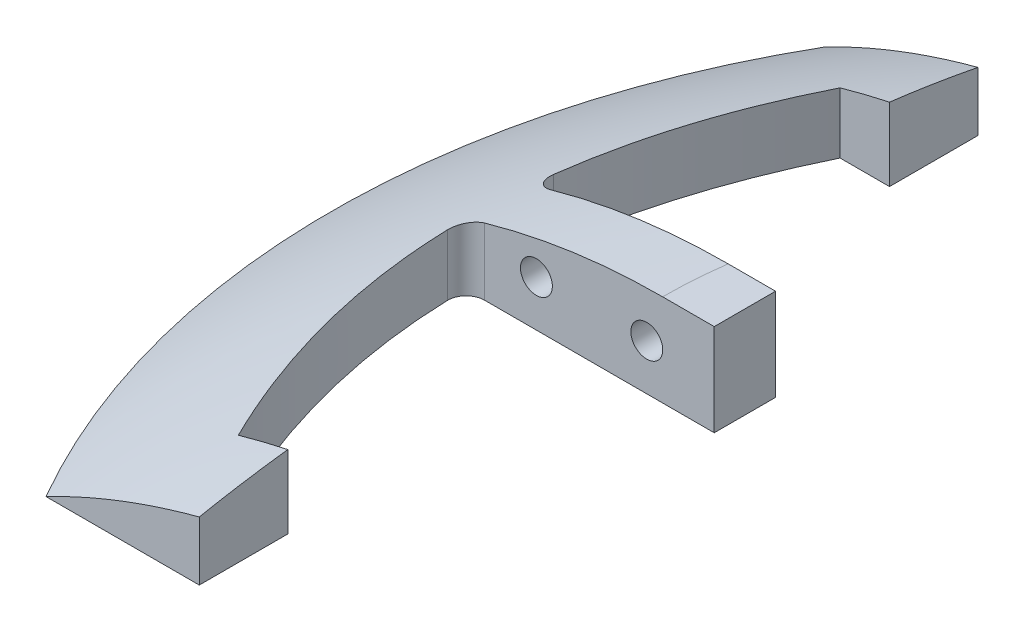
ISO-10303-21;
HEADER;
FILE_DESCRIPTION(('STEP AP214'),'2;1');
FILE_NAME('part.step','',(''),(''),'','','');
FILE_SCHEMA(('AUTOMOTIVE_DESIGN { 1 0 10303 214 1 1 1 1 }'));
ENDSEC;
DATA;
#1=APPLICATION_CONTEXT('core data for automotive mechanical design processes');
#2=APPLICATION_PROTOCOL_DEFINITION('international standard','automotive_design',2000,#1);
#3=PRODUCT_CONTEXT('',#1,'mechanical');
#4=PRODUCT('Part','Part','',(#3));
#5=PRODUCT_RELATED_PRODUCT_CATEGORY('part','',(#4));
#6=PRODUCT_DEFINITION_FORMATION('','',#4);
#7=PRODUCT_DEFINITION_CONTEXT('part definition',#1,'design');
#8=PRODUCT_DEFINITION('design','',#6,#7);
#9=PRODUCT_DEFINITION_SHAPE('','',#8);
#10=(LENGTH_UNIT() NAMED_UNIT(*) SI_UNIT(.MILLI.,.METRE.));
#11=(NAMED_UNIT(*) PLANE_ANGLE_UNIT() SI_UNIT($,.RADIAN.));
#12=(NAMED_UNIT(*) SI_UNIT($,.STERADIAN.) SOLID_ANGLE_UNIT());
#13=UNCERTAINTY_MEASURE_WITH_UNIT(LENGTH_MEASURE(1.E-05),#10,'distance_accuracy_value','');
#14=(GEOMETRIC_REPRESENTATION_CONTEXT(3) GLOBAL_UNCERTAINTY_ASSIGNED_CONTEXT((#13)) GLOBAL_UNIT_ASSIGNED_CONTEXT((#10,
#11,#12)) REPRESENTATION_CONTEXT('',''));
#15=CARTESIAN_POINT('',(0.,0.,0.));
#16=DIRECTION('',(0.,0.,1.));
#17=DIRECTION('',(1.,0.,0.));
#18=AXIS2_PLACEMENT_3D('',#15,#16,#17);
#19=CARTESIAN_POINT('',(-84.9852262806236,7.5,-63.5000000000002));
#20=CARTESIAN_POINT('',(-125.014773719376,7.5,0.));
#21=CARTESIAN_POINT('',(-84.9852262806236,7.5,63.5000000000001));
#22=B_SPLINE_CURVE_WITH_KNOTS('',2,(#19,#20,#21),.UNSPECIFIED.,.F.,.F.,(3,3),(0.,1.),.UNSPECIFIED.);
#23=DIRECTION('',(0.,-1.,0.));
#24=VECTOR('',#23,1.);
#25=SURFACE_OF_LINEAR_EXTRUSION('',#22,#24);
#26=CARTESIAN_POINT('',(-104.503632619014,2.4844137368402,-10.0000000000016));
#27=CARTESIAN_POINT('',(-104.39038974449,2.48571221473041,-11.1409987207815));
#28=CARTESIAN_POINT('',(-104.257897177298,2.48718599004993,-12.2800663291558));
#29=CARTESIAN_POINT('',(-103.955840658117,2.49030211867283,-14.5477913419798));
#30=CARTESIAN_POINT('',(-103.78645513224,2.49194364108574,-15.6764725013493));
#31=CARTESIAN_POINT('',(-103.411636465343,2.49522286994969,-17.9236105062936));
#32=CARTESIAN_POINT('',(-103.206336499811,2.49686056860277,-19.0420895985395));
#33=CARTESIAN_POINT('',(-102.760713583984,2.49992220632697,-21.2690240618336));
#34=CARTESIAN_POINT('',(-102.52048288119,2.5013466889642,-22.3774979102759));
#35=CARTESIAN_POINT('',(-102.00597509761,2.50374974764148,-24.5846129565204));
#36=CARTESIAN_POINT('',(-101.731753848475,2.50472904289542,-25.6832671823901));
#37=CARTESIAN_POINT('',(-101.150208551282,2.50598656282113,-27.8709308051784));
#38=CARTESIAN_POINT('',(-100.842908287548,2.5062652877487,-28.9599465306158));
#39=CARTESIAN_POINT('',(-100.19636988574,2.50584663273233,-31.1276563387816));
#40=CARTESIAN_POINT('',(-99.8571531585273,2.50514990286921,-32.2063568137628));
#41=CARTESIAN_POINT('',(-99.1473966700133,2.50248841586821,-34.3546508875272));
#42=CARTESIAN_POINT('',(-98.7768243402751,2.50052232586703,-35.4242337150415));
#43=CARTESIAN_POINT('',(-98.0051363410378,2.49501070884453,-37.5545970072635));
#44=CARTESIAN_POINT('',(-97.6039642706465,2.4914622038343,-38.6153570158618));
#45=CARTESIAN_POINT('',(-96.7718142704583,2.4824565202525,-40.7283658781046));
#46=CARTESIAN_POINT('',(-96.340759859207,2.47699428723103,-41.7805845679414));
#47=CARTESIAN_POINT('',(-95.4495448489511,2.46381449411995,-43.8767824301226));
#48=CARTESIAN_POINT('',(-94.9892910861478,2.45608939803481,-44.9207219020914));
#49=CARTESIAN_POINT('',(-94.0403366346959,2.43801746232977,-47.000640288502));
#50=CARTESIAN_POINT('',(-93.5515291261471,2.42766021836604,-48.0365703963313));
#51=CARTESIAN_POINT('',(-93.0499740227398,2.4158291200964,-49.0662432702595));
#52=B_SPLINE_CURVE_WITH_KNOTS('',3,(#26,#27,#28,#29,#30,#31,#32,#33,#34,#35,#36,#37,#38,#39,#40,
#41,#42,#43,#44,#45,#46,#47,#48,#49,#50,#51),.UNSPECIFIED.,.F.,.F.,(4,2,2,2,2,2,2,2,2,2,2,2,4),
(0.,3.43962300773532,6.86296634766317,10.2738746249449,13.6759334515565,17.0724764435537,
20.4665933783353,23.8584494186897,27.25387280702,30.6557132777576,34.066607119276,
37.4889919483093,40.9251210937056),.UNSPECIFIED.);
#53=CARTESIAN_POINT('',(-104.109326185646,2.48871872311529,-13.3954628792422));
#54=VERTEX_POINT('',#53);
#55=CARTESIAN_POINT('',(-93.0499740227399,2.4158291200964,-49.0662432702595));
#56=VERTEX_POINT('',#55);
#57=EDGE_CURVE('E206',#54,#56,#52,.T.);
#58=ORIENTED_EDGE('',*,*,#57,.F.);
#59=DIRECTION('',(0.,-1.,0.));
#60=VECTOR('',#59,1.);
#61=CARTESIAN_POINT('',(-104.109326185646,2.48871872311528,-13.3954628792422));
#62=LINE('',#61,#60);
#63=CARTESIAN_POINT('',(-104.109326185646,-7.5,-13.3954628792422));
#64=VERTEX_POINT('',#63);
#65=EDGE_CURVE('E295',#54,#64,#62,.T.);
#66=ORIENTED_EDGE('',*,*,#65,.T.);
#67=CARTESIAN_POINT('',(-84.9852262806236,-7.5,-63.5000000000002));
#68=CARTESIAN_POINT('',(-125.014773719376,-7.5,0.));
#69=CARTESIAN_POINT('',(-84.9852262806236,-7.5,63.5000000000001));
#70=B_SPLINE_CURVE_WITH_KNOTS('',2,(#67,#68,#69),.UNSPECIFIED.,.F.,.F.,(3,3),(0.,1.),.UNSPECIFIED.);
#71=CARTESIAN_POINT('',(-93.0499740227399,-7.5,-49.0662432702595));
#72=VERTEX_POINT('',#71);
#73=EDGE_CURVE('E406',#72,#64,#70,.T.);
#74=ORIENTED_EDGE('',*,*,#73,.F.);
#75=DIRECTION('',(0.,-1.,0.));
#76=VECTOR('',#75,1.);
#77=CARTESIAN_POINT('',(-93.0499740227399,7.5,-49.0662432702595));
#78=LINE('',#77,#76);
#79=EDGE_CURVE('E319',#56,#72,#78,.T.);
#80=ORIENTED_EDGE('',*,*,#79,.F.);
#81=EDGE_LOOP('',(#58,#66,#74,#80));
#82=FACE_BOUND('',#81,.T.);
#83=ADVANCED_FACE('F43',(#82),#25,.T.);
#84=CARTESIAN_POINT('',(-104.952543623561,-7.5,3.09204403478057));
#85=VERTEX_POINT('',#84);
#86=CARTESIAN_POINT('',(-93.0499740227398,-7.5,49.0662432702595));
#87=VERTEX_POINT('',#86);
#88=EDGE_CURVE('E410',#85,#87,#70,.T.);
#89=ORIENTED_EDGE('',*,*,#88,.F.);
#90=DIRECTION('',(0.,-1.,0.));
#91=VECTOR('',#90,1.);
#92=CARTESIAN_POINT('',(-104.952543623561,-7.5,3.09204403478057));
#93=LINE('',#92,#91);
#94=CARTESIAN_POINT('',(-104.952543623561,2.47893244205406,3.09204403478057));
#95=VERTEX_POINT('',#94);
#96=EDGE_CURVE('E298',#85,#95,#93,.F.);
#97=ORIENTED_EDGE('',*,*,#96,.T.);
#98=CARTESIAN_POINT('',(-93.0499740227398,2.41582912009641,49.0662432702595));
#99=CARTESIAN_POINT('',(-93.6533334452972,2.43006078895856,47.8275793431461));
#100=CARTESIAN_POINT('',(-94.2382480620184,2.44216087762937,46.5798405828115));
#101=CARTESIAN_POINT('',(-95.370049832867,2.46270890973188,44.0643802169757));
#102=CARTESIAN_POINT('',(-95.9168631098814,2.47114991512122,42.7966253328832));
#103=CARTESIAN_POINT('',(-96.9696495326401,2.48494964981435,40.2424759308078));
#104=CARTESIAN_POINT('',(-97.4755737741321,2.49030473384928,38.9560612012888));
#105=CARTESIAN_POINT('',(-98.4439232559506,2.49849903994122,36.3660466746763));
#106=CARTESIAN_POINT('',(-98.9063219196583,2.50133673367927,35.0624369250711));
#107=CARTESIAN_POINT('',(-99.7851443932491,2.50505262724198,32.4395457150233));
#108=CARTESIAN_POINT('',(-100.201560578736,2.50593050256973,31.1202616956632));
#109=CARTESIAN_POINT('',(-100.977648032056,2.50625709858713,28.4963387879554));
#110=CARTESIAN_POINT('',(-101.338358373259,2.50573655518803,27.1920075365104));
#111=CARTESIAN_POINT('',(-102.01163776609,2.50379977074595,24.5715754276409));
#112=CARTESIAN_POINT('',(-102.324228003885,2.50238392529425,23.2554800213074));
#113=CARTESIAN_POINT('',(-102.899576220004,2.49908378246815,20.6131872808589));
#114=CARTESIAN_POINT('',(-103.16236172735,2.49719974522057,19.2869959513217));
#115=CARTESIAN_POINT('',(-103.636661331644,2.49333782082038,16.6262495027312));
#116=CARTESIAN_POINT('',(-103.848204331159,2.4913599873285,15.291699536076));
#117=CARTESIAN_POINT('',(-104.218849596912,2.48762345191795,12.615949320621));
#118=CARTESIAN_POINT('',(-104.377977753417,2.48586464208055,11.2747526882577));
#119=CARTESIAN_POINT('',(-104.564534661689,2.48371065402631,9.38251039492335));
#120=CARTESIAN_POINT('',(-104.614171788723,2.48312446575517,8.83358145137155));
#121=CARTESIAN_POINT('',(-104.704517405748,2.4820404699538,7.7350264083826));
#122=CARTESIAN_POINT('',(-104.745226626619,2.48154265518954,7.18540036972083));
#123=CARTESIAN_POINT('',(-104.817674760359,2.48064617639167,6.08558269887138));
#124=CARTESIAN_POINT('',(-104.84941405347,2.48024750815527,5.5353910916512));
#125=CARTESIAN_POINT('',(-104.904039434713,2.47955562196696,4.43157157840989));
#126=CARTESIAN_POINT('',(-104.926876493352,2.47926298861257,3.87794124136384));
#127=CARTESIAN_POINT('',(-104.963426627302,2.47879242452524,2.77035736399906));
#128=CARTESIAN_POINT('',(-104.977139338215,2.47861449837334,2.21640381165628));
#129=CARTESIAN_POINT('',(-104.995427287465,2.47837649250803,1.10830026492215));
#130=CARTESIAN_POINT('',(-105.000001773169,2.47831642250135,0.554150258109645));
#131=CARTESIAN_POINT('',(-105.,2.47831685823798,2.15522044655359E-11));
#132=B_SPLINE_CURVE_WITH_KNOTS('',3,(#98,#99,#100,#101,#102,#103,#104,#105,#106,#107,#108,#109,
#110,#111,#112,#113,#114,#115,#116,#117,#118,#119,#120,#121,#122,#123,#124,#125,#126,#127,#128,
#129,#130,#131),.UNSPECIFIED.,.F.,.F.,(4,2,2,2,2,2,2,2,2,2,2,2,2,2,2,2,4),(0.,4.13355141038385,
8.27490658672607,12.4211437960751,16.5698964853991,20.7193360534658,24.7783251731021,
28.8355220710144,32.8904698152086,36.9431250734582,40.9937755136495,42.6472283266019,
44.300545729547,45.9537930366317,47.6160212081138,49.2783157598707,50.9407472140814),.UNSPECIFIED.);
#133=CARTESIAN_POINT('',(-93.0499740227398,2.41582912009641,49.0662432702595));
#134=VERTEX_POINT('',#133);
#135=EDGE_CURVE('E214',#134,#95,#132,.T.);
#136=ORIENTED_EDGE('',*,*,#135,.F.);
#137=DIRECTION('',(0.,-1.,0.));
#138=VECTOR('',#137,1.);
#139=CARTESIAN_POINT('',(-93.0499740227398,7.5,49.0662432702595));
#140=LINE('',#139,#138);
#141=EDGE_CURVE('E335',#134,#87,#140,.T.);
#142=ORIENTED_EDGE('',*,*,#141,.T.);
#143=EDGE_LOOP('',(#89,#97,#136,#142));
#144=FACE_BOUND('',#143,.T.);
#145=ADVANCED_FACE('F196',(#144),#25,.T.);
#146=CARTESIAN_POINT('',(0.,7.5,-63.5000000000003));
#147=DIRECTION('',(0.,0.,1.));
#148=DIRECTION('',(-1.,0.,0.));
#149=AXIS2_PLACEMENT_3D('',#146,#147,#148);
#150=PLANE('',#149);
#151=DIRECTION('',(0.,-1.,0.));
#152=VECTOR('',#151,1.);
#153=CARTESIAN_POINT('',(-84.9852262806236,7.5,-63.5000000000002));
#154=LINE('',#153,#152);
#155=CARTESIAN_POINT('',(-84.9852262806236,2.12250484436396,-63.5000000000002));
#156=VERTEX_POINT('',#155);
#157=CARTESIAN_POINT('',(-84.9852262806236,-7.5,-63.5000000000002));
#158=VERTEX_POINT('',#157);
#159=EDGE_CURVE('E307',#156,#158,#154,.T.);
#160=ORIENTED_EDGE('',*,*,#159,.T.);
#161=DIRECTION('',(1.,0.,0.));
#162=VECTOR('',#161,1.);
#163=CARTESIAN_POINT('',(0.,-7.5,-63.5000000000003));
#164=LINE('',#163,#162);
#165=CARTESIAN_POINT('',(-109.985226280624,-7.5,-63.5000000000002));
#166=VERTEX_POINT('',#165);
#167=EDGE_CURVE('E157',#166,#158,#164,.T.);
#168=ORIENTED_EDGE('',*,*,#167,.F.);
#169=CARTESIAN_POINT('',(-84.9852262806236,2.12250484436396,-63.5000000000002));
#170=CARTESIAN_POINT('',(-86.0673435178037,1.83387649472302,-63.5000000000002));
#171=CARTESIAN_POINT('',(-87.1458521247826,1.5316399665997,-63.5000000000002));
#172=CARTESIAN_POINT('',(-89.2947643560905,0.89947032018981,-63.5000000000002));
#173=CARTESIAN_POINT('',(-90.3651676592713,0.569536110661675,-63.5000000000002));
#174=CARTESIAN_POINT('',(-92.493686156341,-0.11745042955623,-63.5000000000002));
#175=CARTESIAN_POINT('',(-93.5518286487923,-0.474418099065195,-63.5000000000002));
#176=CARTESIAN_POINT('',(-95.6581197445386,-1.21669464377797,-63.5000000000002));
#177=CARTESIAN_POINT('',(-96.70626844441,-1.60200324479101,-63.5000000000002));
#178=CARTESIAN_POINT('',(-98.7917850164171,-2.40132323332248,-63.5000000000002));
#179=CARTESIAN_POINT('',(-99.8291509254306,-2.81533974570604,-63.5000000000002));
#180=CARTESIAN_POINT('',(-101.891898950522,-3.67221892501526,-63.5000000000002));
#181=CARTESIAN_POINT('',(-102.917281123695,-4.11508145444284,-63.5000000000002));
#182=CARTESIAN_POINT('',(-104.958105420297,-5.03116641170143,-63.5000000000002));
#183=CARTESIAN_POINT('',(-105.973508394399,-5.50447610679844,-63.5000000000002));
#184=CARTESIAN_POINT('',(-107.990214429925,-6.48031504542773,-63.5000000000002));
#185=CARTESIAN_POINT('',(-108.991517020692,-6.98284526145628,-63.5000000000002));
#186=CARTESIAN_POINT('',(-109.985226280624,-7.49999999999998,-63.5000000000002));
#187=B_SPLINE_CURVE_WITH_KNOTS('',3,(#169,#170,#171,#172,#173,#174,#175,#176,#177,#178,#179,
#180,#181,#182,#183,#184,#185,#186),.UNSPECIFIED.,.F.,.F.,(4,2,2,2,2,2,2,2,4),(0.,
3.35978641277657,6.71970525760546,10.0695053903031,13.419273118862,16.7696403868939,
20.1199916861596,23.4804150042808,26.8409502256689),.UNSPECIFIED.);
#188=EDGE_CURVE('E265',#156,#166,#187,.T.);
#189=ORIENTED_EDGE('',*,*,#188,.F.);
#190=EDGE_LOOP('',(#160,#168,#189));
#191=FACE_BOUND('',#190,.T.);
#192=ADVANCED_FACE('F237',(#191),#150,.F.);
#193=CARTESIAN_POINT('',(-84.9852262806236,7.5,0.));
#194=DIRECTION('',(-1.,0.,0.));
#195=DIRECTION('',(0.,0.,-1.));
#196=AXIS2_PLACEMENT_3D('',#193,#194,#195);
#197=PLANE('',#196);
#198=DIRECTION('',(0.,-1.,0.));
#199=VECTOR('',#198,1.);
#200=CARTESIAN_POINT('',(-84.9852262806236,7.5,-49.0662432702595));
#201=LINE('',#200,#199);
#202=CARTESIAN_POINT('',(-84.9852262806236,4.42725673668387,-49.0662432702595));
#203=VERTEX_POINT('',#202);
#204=CARTESIAN_POINT('',(-84.9852262806236,-7.5,-49.0662432702595));
#205=VERTEX_POINT('',#204);
#206=EDGE_CURVE('E342',#203,#205,#201,.T.);
#207=ORIENTED_EDGE('',*,*,#206,.T.);
#208=DIRECTION('',(0.,0.,1.));
#209=VECTOR('',#208,1.);
#210=CARTESIAN_POINT('',(-84.9852262806236,-7.5,0.));
#211=LINE('',#210,#209);
#212=EDGE_CURVE('E415',#158,#205,#211,.T.);
#213=ORIENTED_EDGE('',*,*,#212,.F.);
#214=ORIENTED_EDGE('',*,*,#159,.F.);
#215=CARTESIAN_POINT('',(-84.9852262806236,4.42725673668387,-49.0662432702595));
#216=CARTESIAN_POINT('',(-84.9852262806236,4.27767905395712,-50.2755226134372));
#217=CARTESIAN_POINT('',(-84.9852262806236,4.11838221627253,-51.4836254858928));
#218=CARTESIAN_POINT('',(-84.9852262806236,3.77903248572846,-53.8964901712186));
#219=CARTESIAN_POINT('',(-84.9852262806236,3.59898665679471,-55.1012529789975));
#220=CARTESIAN_POINT('',(-84.9852262806236,3.21671468476342,-57.5073141684525));
#221=CARTESIAN_POINT('',(-84.9852262806236,3.0144877491762,-58.7086124247719));
#222=CARTESIAN_POINT('',(-84.9852262806236,2.58648118719679,-61.1074220711234));
#223=CARTESIAN_POINT('',(-84.9852262806236,2.36069358662157,-62.3049320367865));
#224=CARTESIAN_POINT('',(-84.9852262806236,2.12250484436396,-63.5000000000002));
#225=B_SPLINE_CURVE_WITH_KNOTS('',3,(#215,#216,#217,#218,#219,#220,#221,#222,#223,#224),
.UNSPECIFIED.,.F.,.F.,(4,2,2,2,4),(0.,3.65548264269424,7.30972444448755,10.9640968480984,
14.6197101223374),.UNSPECIFIED.);
#226=EDGE_CURVE('E258',#203,#156,#225,.T.);
#227=ORIENTED_EDGE('',*,*,#226,.F.);
#228=EDGE_LOOP('',(#207,#213,#214,#227));
#229=FACE_BOUND('',#228,.T.);
#230=ADVANCED_FACE('F421',(#229),#197,.F.);
#231=CARTESIAN_POINT('',(0.,7.5,-49.0662432702595));
#232=DIRECTION('',(0.,0.,-1.));
#233=DIRECTION('',(1.,0.,0.));
#234=AXIS2_PLACEMENT_3D('',#231,#232,#233);
#235=PLANE('',#234);
#236=ORIENTED_EDGE('',*,*,#79,.T.);
#237=DIRECTION('',(-1.,0.,0.));
#238=VECTOR('',#237,1.);
#239=CARTESIAN_POINT('',(0.,-7.5,-49.0662432702595));
#240=LINE('',#239,#238);
#241=EDGE_CURVE('E411',#205,#72,#240,.T.);
#242=ORIENTED_EDGE('',*,*,#241,.F.);
#243=ORIENTED_EDGE('',*,*,#206,.F.);
#244=CARTESIAN_POINT('',(-93.0499740227399,2.4158291200964,-49.0662432702595));
#245=CARTESIAN_POINT('',(-92.3837583995304,2.60620307928744,-49.0662432702595));
#246=CARTESIAN_POINT('',(-91.7159055183498,2.79083871139055,-49.0662432702595));
#247=CARTESIAN_POINT('',(-90.3773421753399,3.14866253226787,-49.0662432702595));
#248=CARTESIAN_POINT('',(-89.7066325755399,3.32185394534205,-49.0662432702595));
#249=CARTESIAN_POINT('',(-88.3623990805257,3.6569252783814,-49.0662432702595));
#250=CARTESIAN_POINT('',(-87.6888752004986,3.81880525930444,-49.0662432702595));
#251=CARTESIAN_POINT('',(-86.3390396332992,4.13139772850722,-49.0662432702595));
#252=CARTESIAN_POINT('',(-85.6627272110417,4.28210704305838,-49.0662432702595));
#253=CARTESIAN_POINT('',(-84.9852262806236,4.42725673668388,-49.0662432702595));
#254=B_SPLINE_CURVE_WITH_KNOTS('',3,(#244,#245,#246,#247,#248,#249,#250,#251,#252,#253),
.UNSPECIFIED.,.F.,.F.,(4,2,2,2,4),(0.,2.07861695613121,4.15664576247248,6.2346633693506,
8.31326912227673),.UNSPECIFIED.);
#255=EDGE_CURVE('E251',#56,#203,#254,.T.);
#256=ORIENTED_EDGE('',*,*,#255,.F.);
#257=EDGE_LOOP('',(#236,#242,#243,#256));
#258=FACE_BOUND('',#257,.T.);
#259=ADVANCED_FACE('F201',(#258),#235,.F.);
#260=CARTESIAN_POINT('',(0.,7.5,49.0662432702593));
#261=DIRECTION('',(0.,0.,-1.));
#262=DIRECTION('',(1.,0.,0.));
#263=AXIS2_PLACEMENT_3D('',#260,#261,#262);
#264=PLANE('',#263);
#265=DIRECTION('',(0.,-1.,0.));
#266=VECTOR('',#265,1.);
#267=CARTESIAN_POINT('',(-84.9852262806237,7.5,49.0662432702595));
#268=LINE('',#267,#266);
#269=CARTESIAN_POINT('',(-84.9852262806237,4.42725673668387,49.0662432702595));
#270=VERTEX_POINT('',#269);
#271=CARTESIAN_POINT('',(-84.9852262806237,-7.5,49.0662432702595));
#272=VERTEX_POINT('',#271);
#273=EDGE_CURVE('E340',#270,#272,#268,.T.);
#274=ORIENTED_EDGE('',*,*,#273,.T.);
#275=DIRECTION('',(-1.,0.,0.));
#276=VECTOR('',#275,1.);
#277=CARTESIAN_POINT('',(0.,-7.5,49.0662432702593));
#278=LINE('',#277,#276);
#279=EDGE_CURVE('E339',#272,#87,#278,.T.);
#280=ORIENTED_EDGE('',*,*,#279,.T.);
#281=ORIENTED_EDGE('',*,*,#141,.F.);
#282=CARTESIAN_POINT('',(-84.9852262806237,4.42725673668387,49.0662432702595));
#283=CARTESIAN_POINT('',(-85.6627272110418,4.28210704305837,49.0662432702595));
#284=CARTESIAN_POINT('',(-86.3390396332993,4.13139772850722,49.0662432702595));
#285=CARTESIAN_POINT('',(-87.6888752004986,3.81880525930444,49.0662432702595));
#286=CARTESIAN_POINT('',(-88.3623990805257,3.6569252783814,49.0662432702595));
#287=CARTESIAN_POINT('',(-89.7066325755399,3.32185394534205,49.0662432702595));
#288=CARTESIAN_POINT('',(-90.3773421753399,3.14866253226787,49.0662432702595));
#289=CARTESIAN_POINT('',(-91.7159055183498,2.79083871139056,49.0662432702595));
#290=CARTESIAN_POINT('',(-92.3837583995304,2.60620307928744,49.0662432702595));
#291=CARTESIAN_POINT('',(-93.0499740227398,2.41582912009641,49.0662432702595));
#292=B_SPLINE_CURVE_WITH_KNOTS('',3,(#282,#283,#284,#285,#286,#287,#288,#289,#290,#291),
.UNSPECIFIED.,.F.,.F.,(4,2,2,2,4),(0.,2.07860575292609,4.1566233598042,6.23465216614544,
8.31326912227662),.UNSPECIFIED.);
#293=EDGE_CURVE('E223',#270,#134,#292,.T.);
#294=ORIENTED_EDGE('',*,*,#293,.F.);
#295=EDGE_LOOP('',(#274,#280,#281,#294));
#296=FACE_BOUND('',#295,.T.);
#297=ADVANCED_FACE('F198',(#296),#264,.T.);
#298=CARTESIAN_POINT('',(-84.9852262806238,7.5,1.63423419031503E-13));
#299=DIRECTION('',(1.,0.,0.));
#300=DIRECTION('',(0.,0.,1.));
#301=AXIS2_PLACEMENT_3D('',#298,#299,#300);
#302=PLANE('',#301);
#303=DIRECTION('',(0.,-1.,0.));
#304=VECTOR('',#303,1.);
#305=CARTESIAN_POINT('',(-84.9852262806236,7.5,63.5000000000001));
#306=LINE('',#305,#304);
#307=CARTESIAN_POINT('',(-84.9852262806236,2.12250484436396,63.5000000000001));
#308=VERTEX_POINT('',#307);
#309=CARTESIAN_POINT('',(-84.9852262806236,-7.5,63.5000000000001));
#310=VERTEX_POINT('',#309);
#311=EDGE_CURVE('E344',#308,#310,#306,.T.);
#312=ORIENTED_EDGE('',*,*,#311,.T.);
#313=DIRECTION('',(0.,0.,-1.));
#314=VECTOR('',#313,1.);
#315=CARTESIAN_POINT('',(-84.9852262806238,-7.5,1.63423419031503E-13));
#316=LINE('',#315,#314);
#317=EDGE_CURVE('E398',#310,#272,#316,.T.);
#318=ORIENTED_EDGE('',*,*,#317,.T.);
#319=ORIENTED_EDGE('',*,*,#273,.F.);
#320=CARTESIAN_POINT('',(-84.9852262806236,2.12250484436396,63.5000000000001));
#321=CARTESIAN_POINT('',(-84.9852262806236,2.36069358662157,62.3049320367864));
#322=CARTESIAN_POINT('',(-84.9852262806236,2.58648118719679,61.1074220711234));
#323=CARTESIAN_POINT('',(-84.9852262806236,3.0144877491762,58.7086124247719));
#324=CARTESIAN_POINT('',(-84.9852262806236,3.21671468476343,57.5073141684525));
#325=CARTESIAN_POINT('',(-84.9852262806236,3.59898665679471,55.1012529789975));
#326=CARTESIAN_POINT('',(-84.9852262806237,3.77903248572845,53.8964901712186));
#327=CARTESIAN_POINT('',(-84.9852262806237,4.11838221627251,51.4836254858928));
#328=CARTESIAN_POINT('',(-84.9852262806237,4.27767905395708,50.2755226134372));
#329=CARTESIAN_POINT('',(-84.9852262806237,4.42725673668385,49.0662432702595));
#330=B_SPLINE_CURVE_WITH_KNOTS('',3,(#320,#321,#322,#323,#324,#325,#326,#327,#328,#329),
.UNSPECIFIED.,.F.,.F.,(4,2,2,2,4),(0.,3.65561327423894,7.30998567784977,10.9642274796431,
14.6197101223373),.UNSPECIFIED.);
#331=EDGE_CURVE('E279',#308,#270,#330,.T.);
#332=ORIENTED_EDGE('',*,*,#331,.F.);
#333=EDGE_LOOP('',(#312,#318,#319,#332));
#334=FACE_BOUND('',#333,.T.);
#335=ADVANCED_FACE('F387',(#334),#302,.T.);
#336=CARTESIAN_POINT('',(0.,7.5,63.5000000000001));
#337=DIRECTION('',(0.,0.,1.));
#338=DIRECTION('',(-1.,0.,0.));
#339=AXIS2_PLACEMENT_3D('',#336,#337,#338);
#340=PLANE('',#339);
#341=DIRECTION('',(1.,0.,0.));
#342=VECTOR('',#341,1.);
#343=CARTESIAN_POINT('',(0.,-7.5,63.5000000000001));
#344=LINE('',#343,#342);
#345=CARTESIAN_POINT('',(-109.985226280624,-7.5,63.5000000000001));
#346=VERTEX_POINT('',#345);
#347=EDGE_CURVE('E400',#346,#310,#344,.T.);
#348=ORIENTED_EDGE('',*,*,#347,.T.);
#349=ORIENTED_EDGE('',*,*,#311,.F.);
#350=CARTESIAN_POINT('',(-109.985226280624,-7.5,63.5000000000001));
#351=CARTESIAN_POINT('',(-108.991517020692,-6.98284526145628,63.5000000000001));
#352=CARTESIAN_POINT('',(-107.990214429925,-6.48031504542772,63.5000000000001));
#353=CARTESIAN_POINT('',(-105.973508394399,-5.50447610679844,63.5000000000001));
#354=CARTESIAN_POINT('',(-104.958105420297,-5.03116641170143,63.5000000000001));
#355=CARTESIAN_POINT('',(-102.917281123695,-4.11508145444284,63.5000000000001));
#356=CARTESIAN_POINT('',(-101.891898950523,-3.67221892501525,63.5000000000001));
#357=CARTESIAN_POINT('',(-99.8291509254307,-2.81533974570604,63.5000000000001));
#358=CARTESIAN_POINT('',(-98.7917850164171,-2.40132323332247,63.5000000000001));
#359=CARTESIAN_POINT('',(-96.70626844441,-1.602003244791,63.5000000000001));
#360=CARTESIAN_POINT('',(-95.6581197445386,-1.21669464377796,63.5000000000001));
#361=CARTESIAN_POINT('',(-93.5518286487924,-0.474418099065187,63.5000000000001));
#362=CARTESIAN_POINT('',(-92.4936861563411,-0.117450429556224,63.5000000000001));
#363=CARTESIAN_POINT('',(-90.3651676592713,0.569536110661678,63.5000000000001));
#364=CARTESIAN_POINT('',(-89.2947643560905,0.899470320189814,63.5000000000001));
#365=CARTESIAN_POINT('',(-87.1458521247827,1.5316399665997,63.5000000000001));
#366=CARTESIAN_POINT('',(-86.0673435178037,1.83387649472302,63.5000000000001));
#367=CARTESIAN_POINT('',(-84.9852262806236,2.12250484436396,63.5000000000001));
#368=B_SPLINE_CURVE_WITH_KNOTS('',3,(#350,#351,#352,#353,#354,#355,#356,#357,#358,#359,#360,
#361,#362,#363,#364,#365,#366,#367),.UNSPECIFIED.,.F.,.F.,(4,2,2,2,2,2,2,2,4),(0.,
3.36053522138807,6.72095853950932,10.0713098387749,13.4216771068069,16.7714448353658,
20.1212449680634,23.4811638128923,26.8409502256689),.UNSPECIFIED.);
#369=EDGE_CURVE('E272',#346,#308,#368,.T.);
#370=ORIENTED_EDGE('',*,*,#369,.F.);
#371=EDGE_LOOP('',(#348,#349,#370));
#372=FACE_BOUND('',#371,.T.);
#373=ADVANCED_FACE('F383',(#372),#340,.T.);
#374=CARTESIAN_POINT('',(0.,7.5,0.));
#375=DIRECTION('',(0.,1.,0.));
#376=DIRECTION('',(0.,0.,1.));
#377=AXIS2_PLACEMENT_3D('',#374,#375,#376);
#378=PLANE('',#377);
#379=DIRECTION('',(-1.,0.,5.07248970171096E-13));
#380=VECTOR('',#379,1.);
#381=CARTESIAN_POINT('',(0.,7.5,-3.27194012182897E-11));
#382=LINE('',#381,#380);
#383=CARTESIAN_POINT('',(-64.5036326190144,7.5,0.));
#384=VERTEX_POINT('',#383);
#385=CARTESIAN_POINT('',(-72.9167308680401,7.50000000000001,3.69869366410563E-11));
#386=VERTEX_POINT('',#385);
#387=EDGE_CURVE('E171',#384,#386,#382,.T.);
#388=ORIENTED_EDGE('',*,*,#387,.F.);
#389=DIRECTION('',(0.,0.,1.));
#390=VECTOR('',#389,1.);
#391=CARTESIAN_POINT('',(-64.5036326190144,7.5,0.));
#392=LINE('',#391,#390);
#393=CARTESIAN_POINT('',(-64.5036326190143,7.5,-10.));
#394=VERTEX_POINT('',#393);
#395=EDGE_CURVE('E153',#394,#384,#392,.T.);
#396=ORIENTED_EDGE('',*,*,#395,.F.);
#397=DIRECTION('',(1.,0.,0.));
#398=VECTOR('',#397,1.);
#399=CARTESIAN_POINT('',(3.88578058618708E-13,7.5,-9.9999999999975));
#400=LINE('',#399,#398);
#401=CARTESIAN_POINT('',(-72.2277622558126,7.5,-10.0000000000003));
#402=VERTEX_POINT('',#401);
#403=EDGE_CURVE('E161',#402,#394,#400,.T.);
#404=ORIENTED_EDGE('',*,*,#403,.F.);
#405=CARTESIAN_POINT('',(0.,7.50000000000001,0.));
#406=DIRECTION('',(0.,-1.,0.));
#407=DIRECTION('',(0.,0.,1.));
#408=AXIS2_PLACEMENT_3D('',#405,#406,#407);
#409=CIRCLE('',#408,72.9167308680401);
#410=EDGE_CURVE('E305',#386,#402,#409,.T.);
#411=ORIENTED_EDGE('',*,*,#410,.F.);
#412=EDGE_LOOP('',(#388,#396,#404,#411));
#413=FACE_BOUND('',#412,.T.);
#414=ADVANCED_FACE('F169',(#413),#378,.T.);
#415=CARTESIAN_POINT('',(0.,-7.5,0.));
#416=DIRECTION('',(0.,1.,0.));
#417=DIRECTION('',(0.,0.,1.));
#418=AXIS2_PLACEMENT_3D('',#415,#416,#417);
#419=PLANE('',#418);
#420=ORIENTED_EDGE('',*,*,#167,.T.);
#421=ORIENTED_EDGE('',*,*,#212,.T.);
#422=ORIENTED_EDGE('',*,*,#241,.T.);
#423=ORIENTED_EDGE('',*,*,#73,.T.);
#424=CARTESIAN_POINT('',(-101.135505560399,-7.5,-13.0000000000014));
#425=DIRECTION('',(0.,1.,0.));
#426=DIRECTION('',(0.,0.,1.));
#427=AXIS2_PLACEMENT_3D('',#424,#425,#426);
#428=CIRCLE('',#427,3.);
#429=CARTESIAN_POINT('',(-101.135505560399,-7.5,-10.0000000000014));
#430=VERTEX_POINT('',#429);
#431=EDGE_CURVE('E57',#64,#430,#428,.T.);
#432=ORIENTED_EDGE('',*,*,#431,.T.);
#433=DIRECTION('',(1.,0.,0.));
#434=VECTOR('',#433,1.);
#435=CARTESIAN_POINT('',(3.88578058618708E-13,-7.5,-9.9999999999975));
#436=LINE('',#435,#434);
#437=CARTESIAN_POINT('',(-64.5036326190143,-7.5,-10.));
#438=VERTEX_POINT('',#437);
#439=EDGE_CURVE('E176',#430,#438,#436,.T.);
#440=ORIENTED_EDGE('',*,*,#439,.T.);
#441=DIRECTION('',(0.,0.,1.));
#442=VECTOR('',#441,1.);
#443=CARTESIAN_POINT('',(-64.5036326190144,-7.5,0.));
#444=LINE('',#443,#442);
#445=CARTESIAN_POINT('',(-64.5036326190144,-7.5,0.));
#446=VERTEX_POINT('',#445);
#447=EDGE_CURVE('E156',#438,#446,#444,.T.);
#448=ORIENTED_EDGE('',*,*,#447,.T.);
#449=DIRECTION('',(-1.,0.,5.07248970171096E-13));
#450=VECTOR('',#449,1.);
#451=CARTESIAN_POINT('',(0.,-7.5,-3.27194012182897E-11));
#452=LINE('',#451,#450);
#453=CARTESIAN_POINT('',(-101.953955973407,-7.5,1.89966379540903E-11));
#454=VERTEX_POINT('',#453);
#455=EDGE_CURVE('E167',#446,#454,#452,.T.);
#456=ORIENTED_EDGE('',*,*,#455,.T.);
#457=CARTESIAN_POINT('',(-101.953955973406,-7.5,3.00000000001901));
#458=DIRECTION('',(0.,1.,0.));
#459=DIRECTION('',(0.,0.,1.));
#460=AXIS2_PLACEMENT_3D('',#457,#458,#459);
#461=CIRCLE('',#460,3.);
#462=EDGE_CURVE('E292',#454,#85,#461,.T.);
#463=ORIENTED_EDGE('',*,*,#462,.T.);
#464=ORIENTED_EDGE('',*,*,#88,.T.);
#465=ORIENTED_EDGE('',*,*,#279,.F.);
#466=ORIENTED_EDGE('',*,*,#317,.F.);
#467=ORIENTED_EDGE('',*,*,#347,.F.);
#468=CARTESIAN_POINT('',(0.,-7.5,0.));
#469=DIRECTION('',(0.,-1.,0.));
#470=DIRECTION('',(0.,0.,1.));
#471=AXIS2_PLACEMENT_3D('',#468,#469,#470);
#472=CIRCLE('',#471,127.);
#473=EDGE_CURVE('E399',#346,#166,#472,.T.);
#474=ORIENTED_EDGE('',*,*,#473,.T.);
#475=EDGE_LOOP('',(#420,#421,#422,#423,#432,#440,#448,#456,#463,#464,#465,#466,#467,#474));
#476=FACE_BOUND('',#475,.T.);
#477=ADVANCED_FACE('F310',(#476),#419,.F.);
#478=CARTESIAN_POINT('',(3.88578058618708E-13,7.5,-9.9999999999975));
#479=DIRECTION('',(0.,0.,1.));
#480=DIRECTION('',(-1.,0.,0.));
#481=AXIS2_PLACEMENT_3D('',#478,#479,#480);
#482=PLANE('',#481);
#483=CARTESIAN_POINT('',(-75.5036326190194,0.,-9.99999999999747));
#484=DIRECTION('',(0.,0.,1.));
#485=DIRECTION('',(1.,0.,0.));
#486=AXIS2_PLACEMENT_3D('',#483,#484,#485);
#487=CIRCLE('',#486,2.6);
#488=CARTESIAN_POINT('',(-72.9036326190194,0.,-9.99999999999747));
#489=VERTEX_POINT('',#488);
#490=EDGE_CURVE('E355',#489,#489,#487,.T.);
#491=ORIENTED_EDGE('',*,*,#490,.T.);
#492=EDGE_LOOP('',(#491));
#493=FACE_BOUND('',#492,.T.);
#494=CARTESIAN_POINT('',(-93.5036326190194,0.,-9.99999999999747));
#495=DIRECTION('',(0.,0.,1.));
#496=DIRECTION('',(1.,0.,0.));
#497=AXIS2_PLACEMENT_3D('',#494,#495,#496);
#498=CIRCLE('',#497,2.59999999999999);
#499=CARTESIAN_POINT('',(-90.9036326190194,0.,-9.99999999999747));
#500=VERTEX_POINT('',#499);
#501=EDGE_CURVE('E560',#500,#500,#498,.T.);
#502=ORIENTED_EDGE('',*,*,#501,.T.);
#503=EDGE_LOOP('',(#502));
#504=FACE_BOUND('',#503,.T.);
#505=ORIENTED_EDGE('',*,*,#439,.F.);
#506=DIRECTION('',(0.,1.,0.));
#507=VECTOR('',#506,1.);
#508=CARTESIAN_POINT('',(-101.135505560399,2.4844137368402,-10.0000000000014));
#509=LINE('',#508,#507);
#510=CARTESIAN_POINT('',(-101.135505560399,3.49813584466363,-10.0000000000014));
#511=VERTEX_POINT('',#510);
#512=EDGE_CURVE('E64',#430,#511,#509,.T.);
#513=ORIENTED_EDGE('',*,*,#512,.T.);
#514=CARTESIAN_POINT('',(-72.2277622558126,7.5,-10.0000000000003));
#515=CARTESIAN_POINT('',(-73.5981994009111,7.50001894376805,-10.0000000000004));
#516=CARTESIAN_POINT('',(-74.9686421986202,7.47367508134512,-10.0000000000004));
#517=CARTESIAN_POINT('',(-77.7075025989518,7.36823016058401,-10.0000000000005));
#518=CARTESIAN_POINT('',(-79.075920191738,7.28912884684545,-10.0000000000006));
#519=CARTESIAN_POINT('',(-81.8005713305474,7.07876352348841,-10.0000000000007));
#520=CARTESIAN_POINT('',(-83.1568289886947,6.94781186932179,-10.0000000000007));
#521=CARTESIAN_POINT('',(-85.8632998641938,6.6338402610918,-10.0000000000008));
#522=CARTESIAN_POINT('',(-87.2135131056772,6.45082051509131,-10.0000000000009));
#523=CARTESIAN_POINT('',(-89.9059334497499,6.03288693093674,-10.000000000001));
#524=CARTESIAN_POINT('',(-91.2481402718084,5.79797128528237,-10.000000000001));
#525=CARTESIAN_POINT('',(-93.9224929645949,5.27652624760797,-10.0000000000012));
#526=CARTESIAN_POINT('',(-95.2546388191841,4.98999677281195,-10.0000000000012));
#527=CARTESIAN_POINT('',(-97.9147823282904,4.36382007745633,-10.0000000000013));
#528=CARTESIAN_POINT('',(-99.2427077809243,4.02386605959646,-10.0000000000014));
#529=CARTESIAN_POINT('',(-101.884341100317,3.29256502103045,-10.0000000000015));
#530=CARTESIAN_POINT('',(-103.198048862934,2.90121762415733,-10.0000000000015));
#531=CARTESIAN_POINT('',(-104.503632619014,2.48441373684019,-10.0000000000016));
#532=B_SPLINE_CURVE_WITH_KNOTS('',3,(#514,#515,#516,#517,#518,#519,#520,#521,#522,#523,#524,
#525,#526,#527,#528,#529,#530,#531),.UNSPECIFIED.,.F.,.F.,(4,2,2,2,2,2,2,2,4),(0.,
4.11106685547211,8.22215361288507,12.3088423424437,16.3955147419204,20.4823294999752,
24.5691508123416,28.6803619388462,32.7916031584898),.UNSPECIFIED.);
#533=EDGE_CURVE('E163',#402,#511,#532,.T.);
#534=ORIENTED_EDGE('',*,*,#533,.F.);
#535=ORIENTED_EDGE('',*,*,#403,.T.);
#536=DIRECTION('',(0.,-1.,0.));
#537=VECTOR('',#536,1.);
#538=CARTESIAN_POINT('',(-64.5036326190143,7.5,-10.));
#539=LINE('',#538,#537);
#540=EDGE_CURVE('E149',#394,#438,#539,.T.);
#541=ORIENTED_EDGE('',*,*,#540,.T.);
#542=EDGE_LOOP('',(#505,#513,#534,#535,#541));
#543=FACE_BOUND('',#542,.T.);
#544=ADVANCED_FACE('F162',(#493,#504,#543),#482,.F.);
#545=CARTESIAN_POINT('',(-64.5036326190144,7.5,0.));
#546=DIRECTION('',(-1.,0.,0.));
#547=DIRECTION('',(0.,0.,-1.));
#548=AXIS2_PLACEMENT_3D('',#545,#546,#547);
#549=PLANE('',#548);
#550=ORIENTED_EDGE('',*,*,#447,.F.);
#551=ORIENTED_EDGE('',*,*,#540,.F.);
#552=ORIENTED_EDGE('',*,*,#395,.T.);
#553=DIRECTION('',(0.,-1.,0.));
#554=VECTOR('',#553,1.);
#555=CARTESIAN_POINT('',(-64.5036326190144,7.5,0.));
#556=LINE('',#555,#554);
#557=EDGE_CURVE('E158',#384,#446,#556,.T.);
#558=ORIENTED_EDGE('',*,*,#557,.T.);
#559=EDGE_LOOP('',(#550,#551,#552,#558));
#560=FACE_BOUND('',#559,.T.);
#561=ADVANCED_FACE('F151',(#560),#549,.F.);
#562=CARTESIAN_POINT('',(0.,7.5,-3.27194012182897E-11));
#563=DIRECTION('',(-5.07248970171096E-13,0.,-1.));
#564=DIRECTION('',(1.,0.,-5.07248970171096E-13));
#565=AXIS2_PLACEMENT_3D('',#562,#563,#564);
#566=PLANE('',#565);
#567=CARTESIAN_POINT('',(-75.5036326190194,0.,5.5797380604794E-12));
#568=DIRECTION('',(5.07248970171096E-13,0.,1.));
#569=DIRECTION('',(1.,0.,-5.07248970171096E-13));
#570=AXIS2_PLACEMENT_3D('',#567,#568,#569);
#571=CIRCLE('',#570,2.6);
#572=CARTESIAN_POINT('',(-72.9036326190194,0.,4.26089073803455E-12));
#573=VERTEX_POINT('',#572);
#574=EDGE_CURVE('E178',#573,#573,#571,.T.);
#575=ORIENTED_EDGE('',*,*,#574,.F.);
#576=EDGE_LOOP('',(#575));
#577=FACE_BOUND('',#576,.T.);
#578=CARTESIAN_POINT('',(-93.5036326190194,0.,1.47104550762833E-11));
#579=DIRECTION('',(5.07248970171096E-13,0.,1.));
#580=DIRECTION('',(1.,0.,-5.07248970171096E-13));
#581=AXIS2_PLACEMENT_3D('',#578,#579,#580);
#582=CIRCLE('',#581,2.59999999999999);
#583=CARTESIAN_POINT('',(-90.9036326190194,0.,1.33916077538385E-11));
#584=VERTEX_POINT('',#583);
#585=EDGE_CURVE('E352',#584,#584,#582,.T.);
#586=ORIENTED_EDGE('',*,*,#585,.F.);
#587=EDGE_LOOP('',(#586));
#588=FACE_BOUND('',#587,.T.);
#589=CARTESIAN_POINT('',(-72.9167308680401,-97.5,3.69869366410563E-11));
#590=DIRECTION('',(5.07248970171096E-13,0.,1.));
#591=DIRECTION('',(1.,0.,-5.07248970171096E-13));
#592=AXIS2_PLACEMENT_3D('',#589,#590,#591);
#593=CIRCLE('',#592,105.);
#594=CARTESIAN_POINT('',(-101.953955973407,3.40510174505669,5.171603917238E-11));
#595=VERTEX_POINT('',#594);
#596=EDGE_CURVE('E222',#595,#386,#593,.F.);
#597=ORIENTED_EDGE('',*,*,#596,.F.);
#598=DIRECTION('',(0.,1.,0.));
#599=VECTOR('',#598,1.);
#600=CARTESIAN_POINT('',(-101.953955973407,-7.5,1.89966379540903E-11));
#601=LINE('',#600,#599);
#602=EDGE_CURVE('E299',#595,#454,#601,.F.);
#603=ORIENTED_EDGE('',*,*,#602,.T.);
#604=ORIENTED_EDGE('',*,*,#455,.F.);
#605=ORIENTED_EDGE('',*,*,#557,.F.);
#606=ORIENTED_EDGE('',*,*,#387,.T.);
#607=EDGE_LOOP('',(#597,#603,#604,#605,#606));
#608=FACE_BOUND('',#607,.T.);
#609=ADVANCED_FACE('F308',(#577,#588,#608),#566,.F.);
#610=CARTESIAN_POINT('',(-93.5036326190194,0.,5.00000000000253));
#611=DIRECTION('',(0.,0.,-1.));
#612=DIRECTION('',(1.,0.,0.));
#613=AXIS2_PLACEMENT_3D('',#610,#611,#612);
#614=CYLINDRICAL_SURFACE('',#613,2.59999999999999);
#615=ORIENTED_EDGE('',*,*,#501,.F.);
#616=EDGE_LOOP('',(#615));
#617=FACE_BOUND('',#616,.T.);
#618=ORIENTED_EDGE('',*,*,#585,.T.);
#619=EDGE_LOOP('',(#618));
#620=FACE_BOUND('',#619,.T.);
#621=ADVANCED_FACE('F362',(#617,#620),#614,.F.);
#622=CARTESIAN_POINT('',(-75.5036326190194,0.,5.00000000000253));
#623=DIRECTION('',(0.,0.,-1.));
#624=DIRECTION('',(1.,0.,0.));
#625=AXIS2_PLACEMENT_3D('',#622,#623,#624);
#626=CYLINDRICAL_SURFACE('',#625,2.6);
#627=ORIENTED_EDGE('',*,*,#490,.F.);
#628=EDGE_LOOP('',(#627));
#629=FACE_BOUND('',#628,.T.);
#630=ORIENTED_EDGE('',*,*,#574,.T.);
#631=EDGE_LOOP('',(#630));
#632=FACE_BOUND('',#631,.T.);
#633=ADVANCED_FACE('F235',(#629,#632),#626,.F.);
#634=CARTESIAN_POINT('',(0.,-97.5,0.));
#635=DIRECTION('',(0.,-1.,0.));
#636=DIRECTION('',(0.,0.,-1.));
#637=AXIS2_PLACEMENT_3D('',#634,#635,#636);
#638=DEGENERATE_TOROIDAL_SURFACE('',#637,72.9167308680401,105.,.T.);
#639=ORIENTED_EDGE('',*,*,#369,.T.);
#640=ORIENTED_EDGE('',*,*,#331,.T.);
#641=ORIENTED_EDGE('',*,*,#293,.T.);
#642=ORIENTED_EDGE('',*,*,#135,.T.);
#643=CARTESIAN_POINT('',(-104.952543623561,2.47893244205405,3.09204403478057));
#644=CARTESIAN_POINT('',(-104.955059183741,2.47889647694611,3.01041926206608));
#645=CARTESIAN_POINT('',(-104.954221827249,2.4799071419897,2.92869626055672));
#646=CARTESIAN_POINT('',(-104.945899850815,2.48399422412371,2.76565272728126));
#647=CARTESIAN_POINT('',(-104.938416192132,2.48707034247001,2.684332139024));
#648=CARTESIAN_POINT('',(-104.916882937155,2.49525244529121,2.52283387733228));
#649=CARTESIAN_POINT('',(-104.902846812823,2.5003542617005,2.44265420508556));
#650=CARTESIAN_POINT('',(-104.868360846399,2.51252911109391,2.28386105261586));
#651=CARTESIAN_POINT('',(-104.847910962221,2.5196021570129,2.20524758267366));
#652=CARTESIAN_POINT('',(-104.777184730021,2.54368080207429,1.972581092677));
#653=CARTESIAN_POINT('',(-104.717512228453,2.56355335886831,1.8215571920506));
#654=CARTESIAN_POINT('',(-104.575217869467,2.61014821337816,1.5319860252807));
#655=CARTESIAN_POINT('',(-104.492591158186,2.63687195974401,1.39344140620187));
#656=CARTESIAN_POINT('',(-104.305134062075,2.69680430721579,1.12952886841252));
#657=CARTESIAN_POINT('',(-104.199893030932,2.73013180802796,1.00447952875847));
#658=CARTESIAN_POINT('',(-103.971427662683,2.80177187496779,0.773750005407139));
#659=CARTESIAN_POINT('',(-103.84819938326,2.84008553372602,0.668074079321043));
#660=CARTESIAN_POINT('',(-103.581625331408,2.92221308600023,0.474336292803712));
#661=CARTESIAN_POINT('',(-103.437646810312,2.96619161367817,0.387214835376499));
#662=CARTESIAN_POINT('',(-103.137894380631,3.05690329689559,0.238424345114816));
#663=CARTESIAN_POINT('',(-102.98211896535,3.1036368041308,0.176758569983004));
#664=CARTESIAN_POINT('',(-102.681707522248,3.19292993120912,0.0858943508925034));
#665=CARTESIAN_POINT('',(-102.537920494642,3.2353328420598,0.0537272975980536));
#666=CARTESIAN_POINT('',(-102.320075735932,3.29905235069031,0.0215184741666407));
#667=CARTESIAN_POINT('',(-102.24711112103,3.32030820888329,0.013455832691484));
#668=CARTESIAN_POINT('',(-102.100765047085,3.36276799973058,0.00269661886872659));
#669=CARTESIAN_POINT('',(-102.027383550628,3.38397192747188,5.36032150828027E-07));
#670=CARTESIAN_POINT('',(-101.953955973407,3.40510174505669,1.90076171854756E-11));
#671=B_SPLINE_CURVE_WITH_KNOTS('',3,(#643,#644,#645,#646,#647,#648,#649,#650,#651,#652,#653,
#654,#655,#656,#657,#658,#659,#660,#661,#662,#663,#664,#665,#666,#667,#668,#669,#670),
.UNSPECIFIED.,.F.,.F.,(4,2,2,2,2,2,2,2,2,2,2,2,2,4),(0.,0.244906625778587,0.489777836251319,
0.734147790554572,0.978519348409151,1.46682907796837,1.95524214347534,2.45341374159267,
2.95169468982583,3.47116996321254,3.99071169609187,4.44906056946081,4.67816689922377,
4.90729412597928),.UNSPECIFIED.);
#672=EDGE_CURVE('E286',#95,#595,#671,.T.);
#673=ORIENTED_EDGE('',*,*,#672,.T.);
#674=ORIENTED_EDGE('',*,*,#596,.T.);
#675=ORIENTED_EDGE('',*,*,#410,.T.);
#676=ORIENTED_EDGE('',*,*,#533,.T.);
#677=CARTESIAN_POINT('',(-101.135505560399,3.49813584466364,-10.0000000000014));
#678=CARTESIAN_POINT('',(-101.223255234687,3.47331166088774,-10.0000023355936));
#679=CARTESIAN_POINT('',(-101.310900616437,3.44828553653644,-10.0038520950854));
#680=CARTESIAN_POINT('',(-101.485444158853,3.39798473427084,-10.0191901042835));
#681=CARTESIAN_POINT('',(-101.572342354569,3.37271006813604,-10.0306779936875));
#682=CARTESIAN_POINT('',(-101.830945378127,3.29679414932126,-10.0764838183344));
#683=CARTESIAN_POINT('',(-102.000739179589,3.24600988977796,-10.1221441587846));
#684=CARTESIAN_POINT('',(-102.330086370201,3.14564376136638,-10.2425062899312));
#685=CARTESIAN_POINT('',(-102.489634716718,3.09606249194545,-10.3172222555711));
#686=CARTESIAN_POINT('',(-102.793832455479,2.99964791279591,-10.4938367590299));
#687=CARTESIAN_POINT('',(-102.938485088799,2.95281400624227,-10.5957293662383));
#688=CARTESIAN_POINT('',(-103.207143747902,2.86389355408387,-10.8230764453817));
#689=CARTESIAN_POINT('',(-103.331330355252,2.82176667578857,-10.9483014482555));
#690=CARTESIAN_POINT('',(-103.556559730782,2.7433004027164,-11.2196718522309));
#691=CARTESIAN_POINT('',(-103.657605853996,2.70696016919303,-11.3658142156194));
#692=CARTESIAN_POINT('',(-103.829720599199,2.64270326033974,-11.6693765020906));
#693=CARTESIAN_POINT('',(-103.901728481965,2.61453273084854,-11.826209611473));
#694=CARTESIAN_POINT('',(-104.018007439966,2.56611695542993,-12.150943843547));
#695=CARTESIAN_POINT('',(-104.062293403356,2.54586745768039,-12.3188389716992));
#696=CARTESIAN_POINT('',(-104.117488410931,2.51622229780726,-12.638603377939));
#697=CARTESIAN_POINT('',(-104.131954750268,2.50576637968745,-12.7897601175701));
#698=CARTESIAN_POINT('',(-104.136418846534,2.49537302827724,-13.0170382405994));
#699=CARTESIAN_POINT('',(-104.13502554588,2.49279039486065,-13.0929546146074));
#700=CARTESIAN_POINT('',(-104.126487333168,2.48941092866466,-13.2445193612069));
#701=CARTESIAN_POINT('',(-104.119341187641,2.48861447900047,-13.320167672829));
#702=CARTESIAN_POINT('',(-104.109326185646,2.48871872311528,-13.3954628792422));
#703=B_SPLINE_CURVE_WITH_KNOTS('',3,(#677,#678,#679,#680,#681,#682,#683,#684,#685,#686,#687,
#688,#689,#690,#691,#692,#693,#694,#695,#696,#697,#698,#699,#700,#701,#702),.UNSPECIFIED.,.F.,
.F.,(4,2,2,2,2,2,2,2,2,2,2,2,4),(0.,0.273409726767082,0.54680655729549,1.09304446371413,
1.63954919022505,2.18593475342486,2.72720607831705,3.26839887696235,3.79032227711778,
4.31196513545545,4.76658585242168,4.99429404550529,5.22205107462538),.UNSPECIFIED.);
#704=EDGE_CURVE('E11',#511,#54,#703,.T.);
#705=ORIENTED_EDGE('',*,*,#704,.T.);
#706=ORIENTED_EDGE('',*,*,#57,.T.);
#707=ORIENTED_EDGE('',*,*,#255,.T.);
#708=ORIENTED_EDGE('',*,*,#226,.T.);
#709=ORIENTED_EDGE('',*,*,#188,.T.);
#710=ORIENTED_EDGE('',*,*,#473,.F.);
#711=EDGE_LOOP('',(#639,#640,#641,#642,#673,#674,#675,#676,#705,#706,#707,#708,#709,#710));
#712=FACE_BOUND('',#711,.T.);
#713=ADVANCED_FACE('F230',(#712),#638,.T.);
#714=CARTESIAN_POINT('',(-101.953955973406,-2.51084157087937,3.00000000001901));
#715=DIRECTION('',(0.,-1.,0.));
#716=DIRECTION('',(0.,0.,-1.));
#717=AXIS2_PLACEMENT_3D('',#714,#715,#716);
#718=CYLINDRICAL_SURFACE('',#717,3.);
#719=ORIENTED_EDGE('',*,*,#672,.F.);
#720=ORIENTED_EDGE('',*,*,#96,.F.);
#721=ORIENTED_EDGE('',*,*,#462,.F.);
#722=ORIENTED_EDGE('',*,*,#602,.F.);
#723=EDGE_LOOP('',(#719,#720,#721,#722));
#724=FACE_BOUND('',#723,.T.);
#725=ADVANCED_FACE('F234',(#724),#718,.F.);
#726=CARTESIAN_POINT('',(-101.135505560399,-2.5077931315799,-13.0000000000014));
#727=DIRECTION('',(0.,-1.,0.));
#728=DIRECTION('',(0.,0.,-1.));
#729=AXIS2_PLACEMENT_3D('',#726,#727,#728);
#730=CYLINDRICAL_SURFACE('',#729,3.);
#731=ORIENTED_EDGE('',*,*,#704,.F.);
#732=ORIENTED_EDGE('',*,*,#512,.F.);
#733=ORIENTED_EDGE('',*,*,#431,.F.);
#734=ORIENTED_EDGE('',*,*,#65,.F.);
#735=EDGE_LOOP('',(#731,#732,#733,#734));
#736=FACE_BOUND('',#735,.T.);
#737=ADVANCED_FACE('F45',(#736),#730,.F.);
#738=CLOSED_SHELL('',(#83,#145,#192,#230,#259,#297,#335,#373,#414,#477,#544,#561,#609,#621,#633,
#713,#725,#737));
#739=MANIFOLD_SOLID_BREP('B2',#738);
#740=ADVANCED_BREP_SHAPE_REPRESENTATION('',(#18,#739),#14);
#741=SHAPE_DEFINITION_REPRESENTATION(#9,#740);
ENDSEC;
END-ISO-10303-21;
